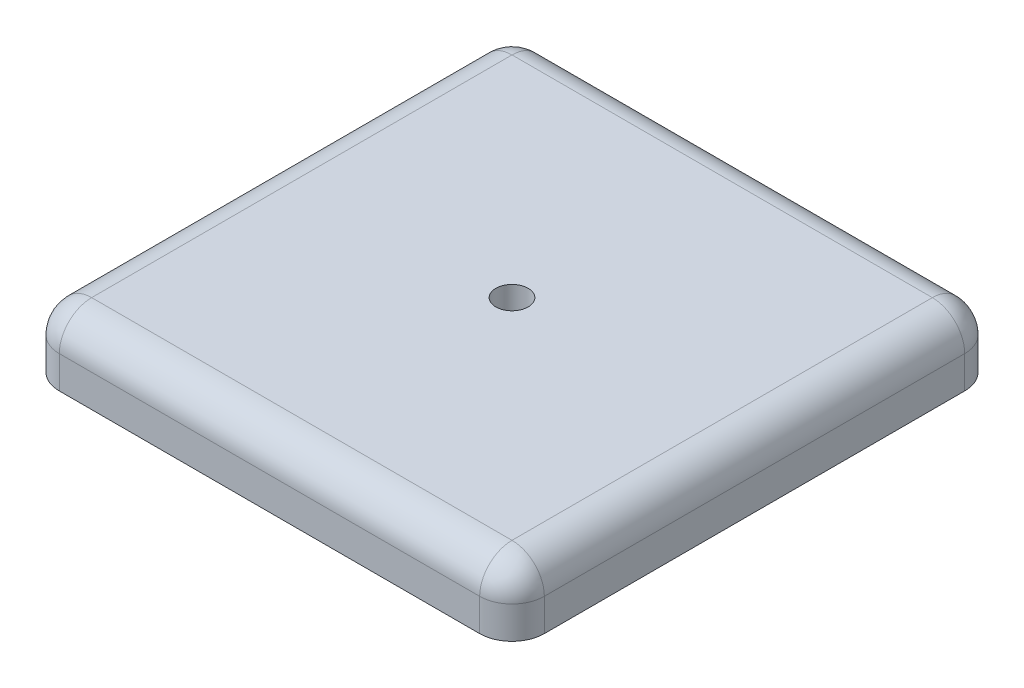
ISO-10303-21;
HEADER;
FILE_DESCRIPTION(('STEP AP214'),'2;1');
FILE_NAME('part.step','',(''),(''),'','','');
FILE_SCHEMA(('AUTOMOTIVE_DESIGN { 1 0 10303 214 1 1 1 1 }'));
ENDSEC;
DATA;
#1=APPLICATION_CONTEXT('core data for automotive mechanical design processes');
#2=APPLICATION_PROTOCOL_DEFINITION('international standard','automotive_design',2000,#1);
#3=PRODUCT_CONTEXT('',#1,'mechanical');
#4=PRODUCT('Part','Part','',(#3));
#5=PRODUCT_RELATED_PRODUCT_CATEGORY('part','',(#4));
#6=PRODUCT_DEFINITION_FORMATION('','',#4);
#7=PRODUCT_DEFINITION_CONTEXT('part definition',#1,'design');
#8=PRODUCT_DEFINITION('design','',#6,#7);
#9=PRODUCT_DEFINITION_SHAPE('','',#8);
#10=(LENGTH_UNIT() NAMED_UNIT(*) SI_UNIT(.MILLI.,.METRE.));
#11=(NAMED_UNIT(*) PLANE_ANGLE_UNIT() SI_UNIT($,.RADIAN.));
#12=(NAMED_UNIT(*) SI_UNIT($,.STERADIAN.) SOLID_ANGLE_UNIT());
#13=UNCERTAINTY_MEASURE_WITH_UNIT(LENGTH_MEASURE(1.E-05),#10,'distance_accuracy_value','');
#14=(GEOMETRIC_REPRESENTATION_CONTEXT(3) GLOBAL_UNCERTAINTY_ASSIGNED_CONTEXT((#13)) GLOBAL_UNIT_ASSIGNED_CONTEXT((#10,
#11,#12)) REPRESENTATION_CONTEXT('',''));
#15=CARTESIAN_POINT('',(0.,0.,0.));
#16=DIRECTION('',(0.,0.,1.));
#17=DIRECTION('',(1.,0.,0.));
#18=AXIS2_PLACEMENT_3D('',#15,#16,#17);
#19=CARTESIAN_POINT('',(0.,0.,0.));
#20=DIRECTION('',(0.,-1.,0.));
#21=DIRECTION('',(0.,0.,-1.));
#22=AXIS2_PLACEMENT_3D('',#19,#20,#21);
#23=PLANE('',#22);
#24=DIRECTION('',(0.,0.,-1.));
#25=VECTOR('',#24,1.);
#26=CARTESIAN_POINT('',(300.,0.,0.));
#27=LINE('',#26,#25);
#28=CARTESIAN_POINT('',(300.,0.,-20.));
#29=VERTEX_POINT('',#28);
#30=CARTESIAN_POINT('',(300.,0.,-280.));
#31=VERTEX_POINT('',#30);
#32=EDGE_CURVE('E291',#29,#31,#27,.T.);
#33=ORIENTED_EDGE('',*,*,#32,.F.);
#34=CARTESIAN_POINT('',(280.,0.,-20.));
#35=DIRECTION('',(0.,-1.,0.));
#36=DIRECTION('',(0.,0.,-1.));
#37=AXIS2_PLACEMENT_3D('',#34,#35,#36);
#38=CIRCLE('',#37,20.);
#39=CARTESIAN_POINT('',(280.,0.,0.));
#40=VERTEX_POINT('',#39);
#41=EDGE_CURVE('E11',#29,#40,#38,.T.);
#42=ORIENTED_EDGE('',*,*,#41,.T.);
#43=DIRECTION('',(1.,0.,0.));
#44=VECTOR('',#43,1.);
#45=CARTESIAN_POINT('',(0.,0.,0.));
#46=LINE('',#45,#44);
#47=CARTESIAN_POINT('',(20.,0.,0.));
#48=VERTEX_POINT('',#47);
#49=EDGE_CURVE('E288',#48,#40,#46,.T.);
#50=ORIENTED_EDGE('',*,*,#49,.F.);
#51=CARTESIAN_POINT('',(20.,0.,-20.));
#52=DIRECTION('',(0.,-1.,0.));
#53=DIRECTION('',(0.,0.,-1.));
#54=AXIS2_PLACEMENT_3D('',#51,#52,#53);
#55=CIRCLE('',#54,20.);
#56=CARTESIAN_POINT('',(0.,0.,-20.));
#57=VERTEX_POINT('',#56);
#58=EDGE_CURVE('E42',#48,#57,#55,.T.);
#59=ORIENTED_EDGE('',*,*,#58,.T.);
#60=DIRECTION('',(0.,0.,1.));
#61=VECTOR('',#60,1.);
#62=CARTESIAN_POINT('',(0.,0.,0.));
#63=LINE('',#62,#61);
#64=CARTESIAN_POINT('',(0.,0.,-280.));
#65=VERTEX_POINT('',#64);
#66=EDGE_CURVE('E285',#65,#57,#63,.T.);
#67=ORIENTED_EDGE('',*,*,#66,.F.);
#68=CARTESIAN_POINT('',(20.,0.,-280.));
#69=DIRECTION('',(0.,-1.,0.));
#70=DIRECTION('',(0.,0.,-1.));
#71=AXIS2_PLACEMENT_3D('',#68,#69,#70);
#72=CIRCLE('',#71,20.);
#73=CARTESIAN_POINT('',(20.,0.,-300.));
#74=VERTEX_POINT('',#73);
#75=EDGE_CURVE('E331',#65,#74,#72,.T.);
#76=ORIENTED_EDGE('',*,*,#75,.T.);
#77=DIRECTION('',(-1.,0.,0.));
#78=VECTOR('',#77,1.);
#79=CARTESIAN_POINT('',(0.,0.,-300.));
#80=LINE('',#79,#78);
#81=CARTESIAN_POINT('',(280.,0.,-300.));
#82=VERTEX_POINT('',#81);
#83=EDGE_CURVE('E294',#82,#74,#80,.T.);
#84=ORIENTED_EDGE('',*,*,#83,.F.);
#85=CARTESIAN_POINT('',(280.,0.,-280.));
#86=DIRECTION('',(0.,-1.,0.));
#87=DIRECTION('',(0.,0.,-1.));
#88=AXIS2_PLACEMENT_3D('',#85,#86,#87);
#89=CIRCLE('',#88,20.);
#90=EDGE_CURVE('E333',#82,#31,#89,.T.);
#91=ORIENTED_EDGE('',*,*,#90,.T.);
#92=EDGE_LOOP('',(#33,#42,#50,#59,#67,#76,#84,#91));
#93=FACE_BOUND('',#92,.T.);
#94=DIRECTION('',(-1.,0.,0.));
#95=VECTOR('',#94,1.);
#96=CARTESIAN_POINT('',(274.5,0.,-25.5));
#97=LINE('',#96,#95);
#98=CARTESIAN_POINT('',(274.5,0.,-25.5));
#99=VERTEX_POINT('',#98);
#100=CARTESIAN_POINT('',(25.5,0.,-25.5));
#101=VERTEX_POINT('',#100);
#102=EDGE_CURVE('E269',#99,#101,#97,.T.);
#103=ORIENTED_EDGE('',*,*,#102,.F.);
#104=DIRECTION('',(0.,0.,1.));
#105=VECTOR('',#104,1.);
#106=CARTESIAN_POINT('',(274.5,0.,-25.5));
#107=LINE('',#106,#105);
#108=CARTESIAN_POINT('',(274.5,0.,-274.5));
#109=VERTEX_POINT('',#108);
#110=EDGE_CURVE('E250',#109,#99,#107,.T.);
#111=ORIENTED_EDGE('',*,*,#110,.F.);
#112=DIRECTION('',(1.,0.,0.));
#113=VECTOR('',#112,1.);
#114=CARTESIAN_POINT('',(274.5,0.,-274.5));
#115=LINE('',#114,#113);
#116=CARTESIAN_POINT('',(25.5,0.,-274.5));
#117=VERTEX_POINT('',#116);
#118=EDGE_CURVE('E260',#117,#109,#115,.T.);
#119=ORIENTED_EDGE('',*,*,#118,.F.);
#120=DIRECTION('',(0.,0.,-1.));
#121=VECTOR('',#120,1.);
#122=CARTESIAN_POINT('',(25.5,0.,-25.5));
#123=LINE('',#122,#121);
#124=EDGE_CURVE('E271',#101,#117,#123,.T.);
#125=ORIENTED_EDGE('',*,*,#124,.F.);
#126=EDGE_LOOP('',(#103,#111,#119,#125));
#127=FACE_BOUND('',#126,.T.);
#128=ADVANCED_FACE('F33',(#93,#127),#23,.T.);
#129=CARTESIAN_POINT('',(0.,40.,0.));
#130=DIRECTION('',(1.,0.,0.));
#131=DIRECTION('',(0.,0.,-1.));
#132=AXIS2_PLACEMENT_3D('',#129,#130,#131);
#133=PLANE('',#132);
#134=ORIENTED_EDGE('',*,*,#66,.T.);
#135=DIRECTION('',(0.,-1.,0.));
#136=VECTOR('',#135,1.);
#137=CARTESIAN_POINT('',(0.,40.,-20.));
#138=LINE('',#137,#136);
#139=CARTESIAN_POINT('',(0.,20.,-20.));
#140=VERTEX_POINT('',#139);
#141=EDGE_CURVE('E329',#57,#140,#138,.F.);
#142=ORIENTED_EDGE('',*,*,#141,.T.);
#143=DIRECTION('',(0.,0.,1.));
#144=VECTOR('',#143,1.);
#145=CARTESIAN_POINT('',(0.,20.,0.));
#146=LINE('',#145,#144);
#147=CARTESIAN_POINT('',(0.,20.,-280.));
#148=VERTEX_POINT('',#147);
#149=EDGE_CURVE('E327',#140,#148,#146,.F.);
#150=ORIENTED_EDGE('',*,*,#149,.T.);
#151=DIRECTION('',(0.,-1.,0.));
#152=VECTOR('',#151,1.);
#153=CARTESIAN_POINT('',(0.,40.,-280.));
#154=LINE('',#153,#152);
#155=EDGE_CURVE('E325',#148,#65,#154,.T.);
#156=ORIENTED_EDGE('',*,*,#155,.T.);
#157=EDGE_LOOP('',(#134,#142,#150,#156));
#158=FACE_BOUND('',#157,.T.);
#159=ADVANCED_FACE('F405',(#158),#133,.F.);
#160=CARTESIAN_POINT('',(0.,40.,0.));
#161=DIRECTION('',(0.,0.,-1.));
#162=DIRECTION('',(-1.,0.,0.));
#163=AXIS2_PLACEMENT_3D('',#160,#161,#162);
#164=PLANE('',#163);
#165=ORIENTED_EDGE('',*,*,#49,.T.);
#166=DIRECTION('',(0.,-1.,0.));
#167=VECTOR('',#166,1.);
#168=CARTESIAN_POINT('',(280.,40.,0.));
#169=LINE('',#168,#167);
#170=CARTESIAN_POINT('',(280.,20.,0.));
#171=VERTEX_POINT('',#170);
#172=EDGE_CURVE('E323',#40,#171,#169,.F.);
#173=ORIENTED_EDGE('',*,*,#172,.T.);
#174=DIRECTION('',(1.,0.,0.));
#175=VECTOR('',#174,1.);
#176=CARTESIAN_POINT('',(0.,20.,0.));
#177=LINE('',#176,#175);
#178=CARTESIAN_POINT('',(20.,20.,0.));
#179=VERTEX_POINT('',#178);
#180=EDGE_CURVE('E321',#171,#179,#177,.F.);
#181=ORIENTED_EDGE('',*,*,#180,.T.);
#182=DIRECTION('',(0.,-1.,0.));
#183=VECTOR('',#182,1.);
#184=CARTESIAN_POINT('',(20.,40.,0.));
#185=LINE('',#184,#183);
#186=EDGE_CURVE('E319',#179,#48,#185,.T.);
#187=ORIENTED_EDGE('',*,*,#186,.T.);
#188=EDGE_LOOP('',(#165,#173,#181,#187));
#189=FACE_BOUND('',#188,.T.);
#190=ADVANCED_FACE('F391',(#189),#164,.F.);
#191=CARTESIAN_POINT('',(300.,40.,0.));
#192=DIRECTION('',(-1.,0.,0.));
#193=DIRECTION('',(0.,0.,1.));
#194=AXIS2_PLACEMENT_3D('',#191,#192,#193);
#195=PLANE('',#194);
#196=DIRECTION('',(0.,0.,-1.));
#197=VECTOR('',#196,1.);
#198=CARTESIAN_POINT('',(300.,20.,0.));
#199=LINE('',#198,#197);
#200=CARTESIAN_POINT('',(300.,20.,-280.));
#201=VERTEX_POINT('',#200);
#202=CARTESIAN_POINT('',(300.,20.,-20.));
#203=VERTEX_POINT('',#202);
#204=EDGE_CURVE('E315',#201,#203,#199,.F.);
#205=ORIENTED_EDGE('',*,*,#204,.T.);
#206=DIRECTION('',(0.,-1.,0.));
#207=VECTOR('',#206,1.);
#208=CARTESIAN_POINT('',(300.,40.,-20.));
#209=LINE('',#208,#207);
#210=EDGE_CURVE('E317',#203,#29,#209,.T.);
#211=ORIENTED_EDGE('',*,*,#210,.T.);
#212=ORIENTED_EDGE('',*,*,#32,.T.);
#213=DIRECTION('',(0.,-1.,0.));
#214=VECTOR('',#213,1.);
#215=CARTESIAN_POINT('',(300.,40.,-280.));
#216=LINE('',#215,#214);
#217=EDGE_CURVE('E313',#31,#201,#216,.F.);
#218=ORIENTED_EDGE('',*,*,#217,.T.);
#219=EDGE_LOOP('',(#205,#211,#212,#218));
#220=FACE_BOUND('',#219,.T.);
#221=ADVANCED_FACE('F430',(#220),#195,.F.);
#222=CARTESIAN_POINT('',(0.,40.,-300.));
#223=DIRECTION('',(0.,0.,1.));
#224=DIRECTION('',(1.,0.,0.));
#225=AXIS2_PLACEMENT_3D('',#222,#223,#224);
#226=PLANE('',#225);
#227=DIRECTION('',(-1.,0.,0.));
#228=VECTOR('',#227,1.);
#229=CARTESIAN_POINT('',(0.,20.,-300.));
#230=LINE('',#229,#228);
#231=CARTESIAN_POINT('',(20.,20.,-300.));
#232=VERTEX_POINT('',#231);
#233=CARTESIAN_POINT('',(280.,20.,-300.));
#234=VERTEX_POINT('',#233);
#235=EDGE_CURVE('E308',#232,#234,#230,.F.);
#236=ORIENTED_EDGE('',*,*,#235,.T.);
#237=DIRECTION('',(0.,-1.,0.));
#238=VECTOR('',#237,1.);
#239=CARTESIAN_POINT('',(280.,40.,-300.));
#240=LINE('',#239,#238);
#241=EDGE_CURVE('E311',#234,#82,#240,.T.);
#242=ORIENTED_EDGE('',*,*,#241,.T.);
#243=ORIENTED_EDGE('',*,*,#83,.T.);
#244=DIRECTION('',(0.,-1.,0.));
#245=VECTOR('',#244,1.);
#246=CARTESIAN_POINT('',(20.,40.,-300.));
#247=LINE('',#246,#245);
#248=EDGE_CURVE('E306',#74,#232,#247,.F.);
#249=ORIENTED_EDGE('',*,*,#248,.T.);
#250=EDGE_LOOP('',(#236,#242,#243,#249));
#251=FACE_BOUND('',#250,.T.);
#252=ADVANCED_FACE('F422',(#251),#226,.F.);
#253=CARTESIAN_POINT('',(0.,40.,0.));
#254=DIRECTION('',(0.,-1.,0.));
#255=DIRECTION('',(0.,0.,-1.));
#256=AXIS2_PLACEMENT_3D('',#253,#254,#255);
#257=PLANE('',#256);
#258=CARTESIAN_POINT('',(150.,40.,-150.));
#259=DIRECTION('',(0.,-1.,0.));
#260=DIRECTION('',(0.,0.,-1.));
#261=AXIS2_PLACEMENT_3D('',#258,#259,#260);
#262=CIRCLE('',#261,10.);
#263=CARTESIAN_POINT('',(150.,40.,-160.));
#264=VERTEX_POINT('',#263);
#265=EDGE_CURVE('E216',#264,#264,#262,.T.);
#266=ORIENTED_EDGE('',*,*,#265,.T.);
#267=EDGE_LOOP('',(#266));
#268=FACE_BOUND('',#267,.T.);
#269=DIRECTION('',(0.,0.,-1.));
#270=VECTOR('',#269,1.);
#271=CARTESIAN_POINT('',(280.,40.,0.));
#272=LINE('',#271,#270);
#273=CARTESIAN_POINT('',(280.,40.,-20.));
#274=VERTEX_POINT('',#273);
#275=CARTESIAN_POINT('',(280.,40.,-280.));
#276=VERTEX_POINT('',#275);
#277=EDGE_CURVE('E301',#274,#276,#272,.T.);
#278=ORIENTED_EDGE('',*,*,#277,.T.);
#279=DIRECTION('',(-1.,0.,0.));
#280=VECTOR('',#279,1.);
#281=CARTESIAN_POINT('',(0.,40.,-280.));
#282=LINE('',#281,#280);
#283=CARTESIAN_POINT('',(20.,40.,-280.));
#284=VERTEX_POINT('',#283);
#285=EDGE_CURVE('E303',#276,#284,#282,.T.);
#286=ORIENTED_EDGE('',*,*,#285,.T.);
#287=DIRECTION('',(0.,0.,1.));
#288=VECTOR('',#287,1.);
#289=CARTESIAN_POINT('',(20.,40.,0.));
#290=LINE('',#289,#288);
#291=CARTESIAN_POINT('',(20.,40.,-20.));
#292=VERTEX_POINT('',#291);
#293=EDGE_CURVE('E297',#284,#292,#290,.T.);
#294=ORIENTED_EDGE('',*,*,#293,.T.);
#295=DIRECTION('',(1.,0.,0.));
#296=VECTOR('',#295,1.);
#297=CARTESIAN_POINT('',(0.,40.,-20.));
#298=LINE('',#297,#296);
#299=EDGE_CURVE('E299',#292,#274,#298,.T.);
#300=ORIENTED_EDGE('',*,*,#299,.T.);
#301=EDGE_LOOP('',(#278,#286,#294,#300));
#302=FACE_BOUND('',#301,.T.);
#303=ADVANCED_FACE('F381',(#268,#302),#257,.F.);
#304=CARTESIAN_POINT('',(280.,40.,-20.));
#305=DIRECTION('',(0.,-1.,0.));
#306=DIRECTION('',(0.,0.,-1.));
#307=AXIS2_PLACEMENT_3D('',#304,#305,#306);
#308=CYLINDRICAL_SURFACE('',#307,20.);
#309=ORIENTED_EDGE('',*,*,#41,.F.);
#310=ORIENTED_EDGE('',*,*,#210,.F.);
#311=CARTESIAN_POINT('',(280.,20.,-20.));
#312=DIRECTION('',(0.,1.,0.));
#313=DIRECTION('',(0.,0.,1.));
#314=AXIS2_PLACEMENT_3D('',#311,#312,#313);
#315=CIRCLE('',#314,20.);
#316=EDGE_CURVE('E37',#171,#203,#315,.T.);
#317=ORIENTED_EDGE('',*,*,#316,.F.);
#318=ORIENTED_EDGE('',*,*,#172,.F.);
#319=EDGE_LOOP('',(#309,#310,#317,#318));
#320=FACE_BOUND('',#319,.T.);
#321=ADVANCED_FACE('F35',(#320),#308,.T.);
#322=CARTESIAN_POINT('',(0.,20.,-20.));
#323=DIRECTION('',(1.,0.,0.));
#324=DIRECTION('',(0.,0.,-1.));
#325=AXIS2_PLACEMENT_3D('',#322,#323,#324);
#326=CYLINDRICAL_SURFACE('',#325,20.);
#327=CARTESIAN_POINT('',(20.,20.,-20.));
#328=DIRECTION('',(-1.,0.,0.));
#329=DIRECTION('',(0.,0.,1.));
#330=AXIS2_PLACEMENT_3D('',#327,#328,#329);
#331=CIRCLE('',#330,20.);
#332=EDGE_CURVE('E360',#179,#292,#331,.T.);
#333=ORIENTED_EDGE('',*,*,#332,.F.);
#334=ORIENTED_EDGE('',*,*,#180,.F.);
#335=CARTESIAN_POINT('',(280.,20.,-20.));
#336=DIRECTION('',(1.,0.,0.));
#337=DIRECTION('',(0.,0.,-1.));
#338=AXIS2_PLACEMENT_3D('',#335,#336,#337);
#339=CIRCLE('',#338,20.);
#340=EDGE_CURVE('E362',#274,#171,#339,.T.);
#341=ORIENTED_EDGE('',*,*,#340,.F.);
#342=ORIENTED_EDGE('',*,*,#299,.F.);
#343=EDGE_LOOP('',(#333,#334,#341,#342));
#344=FACE_BOUND('',#343,.T.);
#345=ADVANCED_FACE('F388',(#344),#326,.T.);
#346=CARTESIAN_POINT('',(20.,40.,-20.));
#347=DIRECTION('',(0.,-1.,0.));
#348=DIRECTION('',(0.,0.,-1.));
#349=AXIS2_PLACEMENT_3D('',#346,#347,#348);
#350=CYLINDRICAL_SURFACE('',#349,20.);
#351=ORIENTED_EDGE('',*,*,#58,.F.);
#352=ORIENTED_EDGE('',*,*,#186,.F.);
#353=CARTESIAN_POINT('',(20.,20.,-20.));
#354=DIRECTION('',(0.,1.,0.));
#355=DIRECTION('',(0.,0.,1.));
#356=AXIS2_PLACEMENT_3D('',#353,#354,#355);
#357=CIRCLE('',#356,20.);
#358=EDGE_CURVE('E357',#140,#179,#357,.T.);
#359=ORIENTED_EDGE('',*,*,#358,.F.);
#360=ORIENTED_EDGE('',*,*,#141,.F.);
#361=EDGE_LOOP('',(#351,#352,#359,#360));
#362=FACE_BOUND('',#361,.T.);
#363=ADVANCED_FACE('F396',(#362),#350,.T.);
#364=CARTESIAN_POINT('',(280.,20.,-20.));
#365=DIRECTION('',(0.,0.,1.));
#366=DIRECTION('',(1.,0.,0.));
#367=AXIS2_PLACEMENT_3D('',#364,#365,#366);
#368=SPHERICAL_SURFACE('',#367,20.);
#369=ORIENTED_EDGE('',*,*,#340,.T.);
#370=ORIENTED_EDGE('',*,*,#316,.T.);
#371=CARTESIAN_POINT('',(280.,20.,-20.));
#372=DIRECTION('',(0.,0.,1.));
#373=DIRECTION('',(1.,0.,0.));
#374=AXIS2_PLACEMENT_3D('',#371,#372,#373);
#375=CIRCLE('',#374,20.);
#376=EDGE_CURVE('E354',#274,#203,#375,.F.);
#377=ORIENTED_EDGE('',*,*,#376,.F.);
#378=EDGE_LOOP('',(#369,#370,#377));
#379=FACE_BOUND('',#378,.T.);
#380=ADVANCED_FACE('F369',(#379),#368,.T.);
#381=CARTESIAN_POINT('',(20.,20.,-20.));
#382=DIRECTION('',(0.,0.,1.));
#383=DIRECTION('',(1.,0.,0.));
#384=AXIS2_PLACEMENT_3D('',#381,#382,#383);
#385=SPHERICAL_SURFACE('',#384,20.);
#386=ORIENTED_EDGE('',*,*,#358,.T.);
#387=ORIENTED_EDGE('',*,*,#332,.T.);
#388=CARTESIAN_POINT('',(20.,20.,-20.));
#389=DIRECTION('',(0.,0.,1.));
#390=DIRECTION('',(1.,0.,0.));
#391=AXIS2_PLACEMENT_3D('',#388,#389,#390);
#392=CIRCLE('',#391,20.);
#393=EDGE_CURVE('E351',#140,#292,#392,.F.);
#394=ORIENTED_EDGE('',*,*,#393,.F.);
#395=EDGE_LOOP('',(#386,#387,#394));
#396=FACE_BOUND('',#395,.T.);
#397=ADVANCED_FACE('F471',(#396),#385,.T.);
#398=CARTESIAN_POINT('',(280.,40.,-280.));
#399=DIRECTION('',(0.,-1.,0.));
#400=DIRECTION('',(0.,0.,-1.));
#401=AXIS2_PLACEMENT_3D('',#398,#399,#400);
#402=CYLINDRICAL_SURFACE('',#401,20.);
#403=ORIENTED_EDGE('',*,*,#90,.F.);
#404=ORIENTED_EDGE('',*,*,#241,.F.);
#405=CARTESIAN_POINT('',(280.,20.,-280.));
#406=DIRECTION('',(0.,1.,0.));
#407=DIRECTION('',(0.,0.,1.));
#408=AXIS2_PLACEMENT_3D('',#405,#406,#407);
#409=CIRCLE('',#408,20.);
#410=EDGE_CURVE('E348',#201,#234,#409,.T.);
#411=ORIENTED_EDGE('',*,*,#410,.F.);
#412=ORIENTED_EDGE('',*,*,#217,.F.);
#413=EDGE_LOOP('',(#403,#404,#411,#412));
#414=FACE_BOUND('',#413,.T.);
#415=ADVANCED_FACE('F428',(#414),#402,.T.);
#416=CARTESIAN_POINT('',(280.,20.,0.));
#417=DIRECTION('',(0.,0.,-1.));
#418=DIRECTION('',(-1.,0.,0.));
#419=AXIS2_PLACEMENT_3D('',#416,#417,#418);
#420=CYLINDRICAL_SURFACE('',#419,20.);
#421=ORIENTED_EDGE('',*,*,#376,.T.);
#422=ORIENTED_EDGE('',*,*,#204,.F.);
#423=CARTESIAN_POINT('',(280.,20.,-280.));
#424=DIRECTION('',(0.,0.,-1.));
#425=DIRECTION('',(-1.,0.,0.));
#426=AXIS2_PLACEMENT_3D('',#423,#424,#425);
#427=CIRCLE('',#426,20.);
#428=EDGE_CURVE('E345',#276,#201,#427,.T.);
#429=ORIENTED_EDGE('',*,*,#428,.F.);
#430=ORIENTED_EDGE('',*,*,#277,.F.);
#431=EDGE_LOOP('',(#421,#422,#429,#430));
#432=FACE_BOUND('',#431,.T.);
#433=ADVANCED_FACE('F376',(#432),#420,.T.);
#434=CARTESIAN_POINT('',(20.,20.,0.));
#435=DIRECTION('',(0.,0.,1.));
#436=DIRECTION('',(1.,0.,0.));
#437=AXIS2_PLACEMENT_3D('',#434,#435,#436);
#438=CYLINDRICAL_SURFACE('',#437,20.);
#439=ORIENTED_EDGE('',*,*,#393,.T.);
#440=ORIENTED_EDGE('',*,*,#293,.F.);
#441=CARTESIAN_POINT('',(20.,20.,-280.));
#442=DIRECTION('',(0.,0.,-1.));
#443=DIRECTION('',(-1.,0.,0.));
#444=AXIS2_PLACEMENT_3D('',#441,#442,#443);
#445=CIRCLE('',#444,20.);
#446=EDGE_CURVE('E342',#148,#284,#445,.T.);
#447=ORIENTED_EDGE('',*,*,#446,.F.);
#448=ORIENTED_EDGE('',*,*,#149,.F.);
#449=EDGE_LOOP('',(#439,#440,#447,#448));
#450=FACE_BOUND('',#449,.T.);
#451=ADVANCED_FACE('F415',(#450),#438,.T.);
#452=CARTESIAN_POINT('',(20.,40.,-280.));
#453=DIRECTION('',(0.,-1.,0.));
#454=DIRECTION('',(0.,0.,-1.));
#455=AXIS2_PLACEMENT_3D('',#452,#453,#454);
#456=CYLINDRICAL_SURFACE('',#455,20.);
#457=ORIENTED_EDGE('',*,*,#75,.F.);
#458=ORIENTED_EDGE('',*,*,#155,.F.);
#459=CARTESIAN_POINT('',(20.,20.,-280.));
#460=DIRECTION('',(0.,1.,0.));
#461=DIRECTION('',(0.,0.,1.));
#462=AXIS2_PLACEMENT_3D('',#459,#460,#461);
#463=CIRCLE('',#462,20.);
#464=EDGE_CURVE('E339',#232,#148,#463,.T.);
#465=ORIENTED_EDGE('',*,*,#464,.F.);
#466=ORIENTED_EDGE('',*,*,#248,.F.);
#467=EDGE_LOOP('',(#457,#458,#465,#466));
#468=FACE_BOUND('',#467,.T.);
#469=ADVANCED_FACE('F411',(#468),#456,.T.);
#470=CARTESIAN_POINT('',(280.,20.,-280.));
#471=DIRECTION('',(0.,0.,1.));
#472=DIRECTION('',(1.,0.,0.));
#473=AXIS2_PLACEMENT_3D('',#470,#471,#472);
#474=SPHERICAL_SURFACE('',#473,20.);
#475=ORIENTED_EDGE('',*,*,#428,.T.);
#476=ORIENTED_EDGE('',*,*,#410,.T.);
#477=CARTESIAN_POINT('',(280.,20.,-280.));
#478=DIRECTION('',(1.,0.,0.));
#479=DIRECTION('',(0.,0.,-1.));
#480=AXIS2_PLACEMENT_3D('',#477,#478,#479);
#481=CIRCLE('',#480,20.);
#482=EDGE_CURVE('E337',#276,#234,#481,.F.);
#483=ORIENTED_EDGE('',*,*,#482,.F.);
#484=EDGE_LOOP('',(#475,#476,#483));
#485=FACE_BOUND('',#484,.T.);
#486=ADVANCED_FACE('F459',(#485),#474,.T.);
#487=CARTESIAN_POINT('',(20.,20.,-280.));
#488=DIRECTION('',(0.,0.,1.));
#489=DIRECTION('',(1.,0.,0.));
#490=AXIS2_PLACEMENT_3D('',#487,#488,#489);
#491=SPHERICAL_SURFACE('',#490,20.);
#492=ORIENTED_EDGE('',*,*,#464,.T.);
#493=ORIENTED_EDGE('',*,*,#446,.T.);
#494=CARTESIAN_POINT('',(20.,20.,-280.));
#495=DIRECTION('',(-1.,0.,0.));
#496=DIRECTION('',(0.,0.,1.));
#497=AXIS2_PLACEMENT_3D('',#494,#495,#496);
#498=CIRCLE('',#497,20.);
#499=EDGE_CURVE('E284',#232,#284,#498,.F.);
#500=ORIENTED_EDGE('',*,*,#499,.F.);
#501=EDGE_LOOP('',(#492,#493,#500));
#502=FACE_BOUND('',#501,.T.);
#503=ADVANCED_FACE('F418',(#502),#491,.T.);
#504=CARTESIAN_POINT('',(0.,20.,-280.));
#505=DIRECTION('',(-1.,0.,0.));
#506=DIRECTION('',(0.,0.,1.));
#507=AXIS2_PLACEMENT_3D('',#504,#505,#506);
#508=CYLINDRICAL_SURFACE('',#507,20.);
#509=ORIENTED_EDGE('',*,*,#482,.T.);
#510=ORIENTED_EDGE('',*,*,#235,.F.);
#511=ORIENTED_EDGE('',*,*,#499,.T.);
#512=ORIENTED_EDGE('',*,*,#285,.F.);
#513=EDGE_LOOP('',(#509,#510,#511,#512));
#514=FACE_BOUND('',#513,.T.);
#515=ADVANCED_FACE('F420',(#514),#508,.T.);
#516=CARTESIAN_POINT('',(274.5,-15.,-25.5));
#517=DIRECTION('',(-1.,0.,0.));
#518=DIRECTION('',(0.,0.,1.));
#519=AXIS2_PLACEMENT_3D('',#516,#517,#518);
#520=PLANE('',#519);
#521=ORIENTED_EDGE('',*,*,#110,.T.);
#522=DIRECTION('',(0.,1.,0.));
#523=VECTOR('',#522,1.);
#524=CARTESIAN_POINT('',(274.5,-15.,-25.5));
#525=LINE('',#524,#523);
#526=CARTESIAN_POINT('',(274.5,-15.,-25.5));
#527=VERTEX_POINT('',#526);
#528=EDGE_CURVE('E282',#527,#99,#525,.T.);
#529=ORIENTED_EDGE('',*,*,#528,.F.);
#530=DIRECTION('',(0.,0.,1.));
#531=VECTOR('',#530,1.);
#532=CARTESIAN_POINT('',(274.5,-15.,-25.5));
#533=LINE('',#532,#531);
#534=CARTESIAN_POINT('',(274.5,-15.,-274.5));
#535=VERTEX_POINT('',#534);
#536=EDGE_CURVE('E256',#535,#527,#533,.T.);
#537=ORIENTED_EDGE('',*,*,#536,.F.);
#538=DIRECTION('',(0.,1.,0.));
#539=VECTOR('',#538,1.);
#540=CARTESIAN_POINT('',(274.5,-15.,-274.5));
#541=LINE('',#540,#539);
#542=EDGE_CURVE('E266',#535,#109,#541,.T.);
#543=ORIENTED_EDGE('',*,*,#542,.T.);
#544=EDGE_LOOP('',(#521,#529,#537,#543));
#545=FACE_BOUND('',#544,.T.);
#546=ADVANCED_FACE('F456',(#545),#520,.F.);
#547=CARTESIAN_POINT('',(274.5,-15.,-25.5));
#548=DIRECTION('',(0.,0.,-1.));
#549=DIRECTION('',(-1.,0.,0.));
#550=AXIS2_PLACEMENT_3D('',#547,#548,#549);
#551=PLANE('',#550);
#552=ORIENTED_EDGE('',*,*,#102,.T.);
#553=DIRECTION('',(0.,1.,0.));
#554=VECTOR('',#553,1.);
#555=CARTESIAN_POINT('',(25.5,-15.,-25.5));
#556=LINE('',#555,#554);
#557=CARTESIAN_POINT('',(25.5,-15.,-25.5));
#558=VERTEX_POINT('',#557);
#559=EDGE_CURVE('E279',#558,#101,#556,.T.);
#560=ORIENTED_EDGE('',*,*,#559,.F.);
#561=DIRECTION('',(-1.,0.,0.));
#562=VECTOR('',#561,1.);
#563=CARTESIAN_POINT('',(274.5,-15.,-25.5));
#564=LINE('',#563,#562);
#565=EDGE_CURVE('E259',#527,#558,#564,.T.);
#566=ORIENTED_EDGE('',*,*,#565,.F.);
#567=ORIENTED_EDGE('',*,*,#528,.T.);
#568=EDGE_LOOP('',(#552,#560,#566,#567));
#569=FACE_BOUND('',#568,.T.);
#570=ADVANCED_FACE('F524',(#569),#551,.F.);
#571=CARTESIAN_POINT('',(25.5,-15.,-25.5));
#572=DIRECTION('',(1.,0.,0.));
#573=DIRECTION('',(0.,0.,-1.));
#574=AXIS2_PLACEMENT_3D('',#571,#572,#573);
#575=PLANE('',#574);
#576=ORIENTED_EDGE('',*,*,#124,.T.);
#577=DIRECTION('',(0.,1.,0.));
#578=VECTOR('',#577,1.);
#579=CARTESIAN_POINT('',(25.5,-15.,-274.5));
#580=LINE('',#579,#578);
#581=CARTESIAN_POINT('',(25.5,-15.,-274.5));
#582=VERTEX_POINT('',#581);
#583=EDGE_CURVE('E277',#582,#117,#580,.T.);
#584=ORIENTED_EDGE('',*,*,#583,.F.);
#585=DIRECTION('',(0.,0.,-1.));
#586=VECTOR('',#585,1.);
#587=CARTESIAN_POINT('',(25.5,-15.,-25.5));
#588=LINE('',#587,#586);
#589=EDGE_CURVE('E262',#558,#582,#588,.T.);
#590=ORIENTED_EDGE('',*,*,#589,.F.);
#591=ORIENTED_EDGE('',*,*,#559,.T.);
#592=EDGE_LOOP('',(#576,#584,#590,#591));
#593=FACE_BOUND('',#592,.T.);
#594=ADVANCED_FACE('F531',(#593),#575,.F.);
#595=CARTESIAN_POINT('',(274.5,-15.,-274.5));
#596=DIRECTION('',(0.,0.,1.));
#597=DIRECTION('',(1.,0.,0.));
#598=AXIS2_PLACEMENT_3D('',#595,#596,#597);
#599=PLANE('',#598);
#600=ORIENTED_EDGE('',*,*,#118,.T.);
#601=ORIENTED_EDGE('',*,*,#542,.F.);
#602=DIRECTION('',(1.,0.,0.));
#603=VECTOR('',#602,1.);
#604=CARTESIAN_POINT('',(274.5,-15.,-274.5));
#605=LINE('',#604,#603);
#606=EDGE_CURVE('E264',#582,#535,#605,.T.);
#607=ORIENTED_EDGE('',*,*,#606,.F.);
#608=ORIENTED_EDGE('',*,*,#583,.T.);
#609=EDGE_LOOP('',(#600,#601,#607,#608));
#610=FACE_BOUND('',#609,.T.);
#611=ADVANCED_FACE('F539',(#610),#599,.F.);
#612=CARTESIAN_POINT('',(0.,-15.,0.));
#613=DIRECTION('',(0.,1.,0.));
#614=DIRECTION('',(0.,0.,1.));
#615=AXIS2_PLACEMENT_3D('',#612,#613,#614);
#616=PLANE('',#615);
#617=CARTESIAN_POINT('',(150.,-15.,-150.));
#618=DIRECTION('',(0.,-1.,0.));
#619=DIRECTION('',(0.,0.,-1.));
#620=AXIS2_PLACEMENT_3D('',#617,#618,#619);
#621=CIRCLE('',#620,10.);
#622=CARTESIAN_POINT('',(150.,-15.,-160.));
#623=VERTEX_POINT('',#622);
#624=EDGE_CURVE('E209',#623,#623,#621,.T.);
#625=ORIENTED_EDGE('',*,*,#624,.F.);
#626=EDGE_LOOP('',(#625));
#627=FACE_BOUND('',#626,.T.);
#628=DIRECTION('',(1.,0.,0.));
#629=VECTOR('',#628,1.);
#630=CARTESIAN_POINT('',(80.,-15.,-240.));
#631=LINE('',#630,#629);
#632=CARTESIAN_POINT('',(80.,-15.,-240.));
#633=VERTEX_POINT('',#632);
#634=CARTESIAN_POINT('',(220.,-15.,-240.));
#635=VERTEX_POINT('',#634);
#636=EDGE_CURVE('E215',#633,#635,#631,.T.);
#637=ORIENTED_EDGE('',*,*,#636,.F.);
#638=DIRECTION('',(0.,0.,-1.));
#639=VECTOR('',#638,1.);
#640=CARTESIAN_POINT('',(80.,-15.,-180.));
#641=LINE('',#640,#639);
#642=CARTESIAN_POINT('',(80.,-15.,-180.));
#643=VERTEX_POINT('',#642);
#644=EDGE_CURVE('E50',#643,#633,#641,.T.);
#645=ORIENTED_EDGE('',*,*,#644,.F.);
#646=DIRECTION('',(-1.,0.,0.));
#647=VECTOR('',#646,1.);
#648=CARTESIAN_POINT('',(80.,-15.,-180.));
#649=LINE('',#648,#647);
#650=CARTESIAN_POINT('',(220.,-15.,-180.));
#651=VERTEX_POINT('',#650);
#652=EDGE_CURVE('E203',#651,#643,#649,.T.);
#653=ORIENTED_EDGE('',*,*,#652,.F.);
#654=DIRECTION('',(0.,0.,1.));
#655=VECTOR('',#654,1.);
#656=CARTESIAN_POINT('',(220.,-15.,-180.));
#657=LINE('',#656,#655);
#658=EDGE_CURVE('E206',#635,#651,#657,.T.);
#659=ORIENTED_EDGE('',*,*,#658,.F.);
#660=EDGE_LOOP('',(#637,#645,#653,#659));
#661=FACE_BOUND('',#660,.T.);
#662=DIRECTION('',(1.,0.,0.));
#663=VECTOR('',#662,1.);
#664=CARTESIAN_POINT('',(80.,-15.,-120.));
#665=LINE('',#664,#663);
#666=CARTESIAN_POINT('',(80.,-15.,-120.));
#667=VERTEX_POINT('',#666);
#668=CARTESIAN_POINT('',(220.,-15.,-120.));
#669=VERTEX_POINT('',#668);
#670=EDGE_CURVE('E240',#667,#669,#665,.T.);
#671=ORIENTED_EDGE('',*,*,#670,.F.);
#672=DIRECTION('',(0.,0.,-1.));
#673=VECTOR('',#672,1.);
#674=CARTESIAN_POINT('',(80.,-15.,-60.));
#675=LINE('',#674,#673);
#676=CARTESIAN_POINT('',(80.,-15.,-60.));
#677=VERTEX_POINT('',#676);
#678=EDGE_CURVE('E58',#677,#667,#675,.T.);
#679=ORIENTED_EDGE('',*,*,#678,.F.);
#680=DIRECTION('',(-1.,0.,0.));
#681=VECTOR('',#680,1.);
#682=CARTESIAN_POINT('',(80.,-15.,-60.));
#683=LINE('',#682,#681);
#684=CARTESIAN_POINT('',(220.,-15.,-60.));
#685=VERTEX_POINT('',#684);
#686=EDGE_CURVE('E229',#685,#677,#683,.T.);
#687=ORIENTED_EDGE('',*,*,#686,.F.);
#688=DIRECTION('',(0.,0.,1.));
#689=VECTOR('',#688,1.);
#690=CARTESIAN_POINT('',(220.,-15.,-60.));
#691=LINE('',#690,#689);
#692=EDGE_CURVE('E243',#669,#685,#691,.T.);
#693=ORIENTED_EDGE('',*,*,#692,.F.);
#694=EDGE_LOOP('',(#671,#679,#687,#693));
#695=FACE_BOUND('',#694,.T.);
#696=ORIENTED_EDGE('',*,*,#536,.T.);
#697=ORIENTED_EDGE('',*,*,#565,.T.);
#698=ORIENTED_EDGE('',*,*,#589,.T.);
#699=ORIENTED_EDGE('',*,*,#606,.T.);
#700=EDGE_LOOP('',(#696,#697,#698,#699));
#701=FACE_BOUND('',#700,.T.);
#702=ADVANCED_FACE('F547',(#627,#661,#695,#701),#616,.F.);
#703=CARTESIAN_POINT('',(80.,10.,-60.));
#704=DIRECTION('',(-1.,0.,0.));
#705=DIRECTION('',(0.,0.,1.));
#706=AXIS2_PLACEMENT_3D('',#703,#704,#705);
#707=PLANE('',#706);
#708=ORIENTED_EDGE('',*,*,#678,.T.);
#709=DIRECTION('',(0.,-1.,0.));
#710=VECTOR('',#709,1.);
#711=CARTESIAN_POINT('',(80.,10.,-120.));
#712=LINE('',#711,#710);
#713=CARTESIAN_POINT('',(80.,10.,-120.));
#714=VERTEX_POINT('',#713);
#715=EDGE_CURVE('E238',#714,#667,#712,.T.);
#716=ORIENTED_EDGE('',*,*,#715,.F.);
#717=DIRECTION('',(0.,0.,-1.));
#718=VECTOR('',#717,1.);
#719=CARTESIAN_POINT('',(80.,10.,-60.));
#720=LINE('',#719,#718);
#721=CARTESIAN_POINT('',(80.,10.,-60.));
#722=VERTEX_POINT('',#721);
#723=EDGE_CURVE('E225',#722,#714,#720,.T.);
#724=ORIENTED_EDGE('',*,*,#723,.F.);
#725=DIRECTION('',(0.,-1.,0.));
#726=VECTOR('',#725,1.);
#727=CARTESIAN_POINT('',(80.,10.,-60.));
#728=LINE('',#727,#726);
#729=EDGE_CURVE('E248',#722,#677,#728,.T.);
#730=ORIENTED_EDGE('',*,*,#729,.T.);
#731=EDGE_LOOP('',(#708,#716,#724,#730));
#732=FACE_BOUND('',#731,.T.);
#733=ADVANCED_FACE('F557',(#732),#707,.F.);
#734=CARTESIAN_POINT('',(80.,10.,-60.));
#735=DIRECTION('',(0.,0.,1.));
#736=DIRECTION('',(1.,0.,0.));
#737=AXIS2_PLACEMENT_3D('',#734,#735,#736);
#738=PLANE('',#737);
#739=ORIENTED_EDGE('',*,*,#686,.T.);
#740=ORIENTED_EDGE('',*,*,#729,.F.);
#741=DIRECTION('',(-1.,0.,0.));
#742=VECTOR('',#741,1.);
#743=CARTESIAN_POINT('',(80.,10.,-60.));
#744=LINE('',#743,#742);
#745=CARTESIAN_POINT('',(220.,10.,-60.));
#746=VERTEX_POINT('',#745);
#747=EDGE_CURVE('E235',#746,#722,#744,.T.);
#748=ORIENTED_EDGE('',*,*,#747,.F.);
#749=DIRECTION('',(0.,-1.,0.));
#750=VECTOR('',#749,1.);
#751=CARTESIAN_POINT('',(220.,10.,-60.));
#752=LINE('',#751,#750);
#753=EDGE_CURVE('E251',#746,#685,#752,.T.);
#754=ORIENTED_EDGE('',*,*,#753,.T.);
#755=EDGE_LOOP('',(#739,#740,#748,#754));
#756=FACE_BOUND('',#755,.T.);
#757=ADVANCED_FACE('F567',(#756),#738,.F.);
#758=CARTESIAN_POINT('',(220.,10.,-60.));
#759=DIRECTION('',(1.,0.,0.));
#760=DIRECTION('',(0.,0.,-1.));
#761=AXIS2_PLACEMENT_3D('',#758,#759,#760);
#762=PLANE('',#761);
#763=ORIENTED_EDGE('',*,*,#692,.T.);
#764=ORIENTED_EDGE('',*,*,#753,.F.);
#765=DIRECTION('',(0.,0.,1.));
#766=VECTOR('',#765,1.);
#767=CARTESIAN_POINT('',(220.,10.,-60.));
#768=LINE('',#767,#766);
#769=CARTESIAN_POINT('',(220.,10.,-120.));
#770=VERTEX_POINT('',#769);
#771=EDGE_CURVE('E232',#770,#746,#768,.T.);
#772=ORIENTED_EDGE('',*,*,#771,.F.);
#773=DIRECTION('',(0.,-1.,0.));
#774=VECTOR('',#773,1.);
#775=CARTESIAN_POINT('',(220.,10.,-120.));
#776=LINE('',#775,#774);
#777=EDGE_CURVE('E253',#770,#669,#776,.T.);
#778=ORIENTED_EDGE('',*,*,#777,.T.);
#779=EDGE_LOOP('',(#763,#764,#772,#778));
#780=FACE_BOUND('',#779,.T.);
#781=ADVANCED_FACE('F573',(#780),#762,.F.);
#782=CARTESIAN_POINT('',(80.,10.,-120.));
#783=DIRECTION('',(0.,0.,-1.));
#784=DIRECTION('',(-1.,0.,0.));
#785=AXIS2_PLACEMENT_3D('',#782,#783,#784);
#786=PLANE('',#785);
#787=ORIENTED_EDGE('',*,*,#670,.T.);
#788=ORIENTED_EDGE('',*,*,#777,.F.);
#789=DIRECTION('',(1.,0.,0.));
#790=VECTOR('',#789,1.);
#791=CARTESIAN_POINT('',(80.,10.,-120.));
#792=LINE('',#791,#790);
#793=EDGE_CURVE('E228',#714,#770,#792,.T.);
#794=ORIENTED_EDGE('',*,*,#793,.F.);
#795=ORIENTED_EDGE('',*,*,#715,.T.);
#796=EDGE_LOOP('',(#787,#788,#794,#795));
#797=FACE_BOUND('',#796,.T.);
#798=ADVANCED_FACE('F581',(#797),#786,.F.);
#799=CARTESIAN_POINT('',(0.,10.,0.));
#800=DIRECTION('',(0.,-1.,0.));
#801=DIRECTION('',(0.,0.,-1.));
#802=AXIS2_PLACEMENT_3D('',#799,#800,#801);
#803=PLANE('',#802);
#804=ORIENTED_EDGE('',*,*,#723,.T.);
#805=ORIENTED_EDGE('',*,*,#793,.T.);
#806=ORIENTED_EDGE('',*,*,#771,.T.);
#807=ORIENTED_EDGE('',*,*,#747,.T.);
#808=EDGE_LOOP('',(#804,#805,#806,#807));
#809=FACE_BOUND('',#808,.T.);
#810=ADVANCED_FACE('F589',(#809),#803,.T.);
#811=CARTESIAN_POINT('',(80.,10.,-180.));
#812=DIRECTION('',(-1.,0.,0.));
#813=DIRECTION('',(0.,0.,1.));
#814=AXIS2_PLACEMENT_3D('',#811,#812,#813);
#815=PLANE('',#814);
#816=ORIENTED_EDGE('',*,*,#644,.T.);
#817=DIRECTION('',(0.,-1.,0.));
#818=VECTOR('',#817,1.);
#819=CARTESIAN_POINT('',(80.,10.,-240.));
#820=LINE('',#819,#818);
#821=CARTESIAN_POINT('',(80.,10.,-240.));
#822=VERTEX_POINT('',#821);
#823=EDGE_CURVE('E181',#822,#633,#820,.T.);
#824=ORIENTED_EDGE('',*,*,#823,.F.);
#825=DIRECTION('',(0.,0.,-1.));
#826=VECTOR('',#825,1.);
#827=CARTESIAN_POINT('',(80.,10.,-180.));
#828=LINE('',#827,#826);
#829=CARTESIAN_POINT('',(80.,10.,-180.));
#830=VERTEX_POINT('',#829);
#831=EDGE_CURVE('E185',#830,#822,#828,.T.);
#832=ORIENTED_EDGE('',*,*,#831,.F.);
#833=DIRECTION('',(0.,-1.,0.));
#834=VECTOR('',#833,1.);
#835=CARTESIAN_POINT('',(80.,10.,-180.));
#836=LINE('',#835,#834);
#837=EDGE_CURVE('E220',#830,#643,#836,.T.);
#838=ORIENTED_EDGE('',*,*,#837,.T.);
#839=EDGE_LOOP('',(#816,#824,#832,#838));
#840=FACE_BOUND('',#839,.T.);
#841=ADVANCED_FACE('F183',(#840),#815,.F.);
#842=CARTESIAN_POINT('',(80.,10.,-180.));
#843=DIRECTION('',(0.,0.,1.));
#844=DIRECTION('',(1.,0.,0.));
#845=AXIS2_PLACEMENT_3D('',#842,#843,#844);
#846=PLANE('',#845);
#847=ORIENTED_EDGE('',*,*,#652,.T.);
#848=ORIENTED_EDGE('',*,*,#837,.F.);
#849=DIRECTION('',(-1.,0.,0.));
#850=VECTOR('',#849,1.);
#851=CARTESIAN_POINT('',(80.,10.,-180.));
#852=LINE('',#851,#850);
#853=CARTESIAN_POINT('',(220.,10.,-180.));
#854=VERTEX_POINT('',#853);
#855=EDGE_CURVE('E191',#854,#830,#852,.T.);
#856=ORIENTED_EDGE('',*,*,#855,.F.);
#857=DIRECTION('',(0.,-1.,0.));
#858=VECTOR('',#857,1.);
#859=CARTESIAN_POINT('',(220.,10.,-180.));
#860=LINE('',#859,#858);
#861=EDGE_CURVE('E222',#854,#651,#860,.T.);
#862=ORIENTED_EDGE('',*,*,#861,.T.);
#863=EDGE_LOOP('',(#847,#848,#856,#862));
#864=FACE_BOUND('',#863,.T.);
#865=ADVANCED_FACE('F604',(#864),#846,.F.);
#866=CARTESIAN_POINT('',(220.,10.,-180.));
#867=DIRECTION('',(1.,0.,0.));
#868=DIRECTION('',(0.,0.,-1.));
#869=AXIS2_PLACEMENT_3D('',#866,#867,#868);
#870=PLANE('',#869);
#871=ORIENTED_EDGE('',*,*,#658,.T.);
#872=ORIENTED_EDGE('',*,*,#861,.F.);
#873=DIRECTION('',(0.,0.,1.));
#874=VECTOR('',#873,1.);
#875=CARTESIAN_POINT('',(220.,10.,-180.));
#876=LINE('',#875,#874);
#877=CARTESIAN_POINT('',(220.,10.,-240.));
#878=VERTEX_POINT('',#877);
#879=EDGE_CURVE('E199',#878,#854,#876,.T.);
#880=ORIENTED_EDGE('',*,*,#879,.F.);
#881=DIRECTION('',(0.,-1.,0.));
#882=VECTOR('',#881,1.);
#883=CARTESIAN_POINT('',(220.,10.,-240.));
#884=LINE('',#883,#882);
#885=EDGE_CURVE('E190',#878,#635,#884,.T.);
#886=ORIENTED_EDGE('',*,*,#885,.T.);
#887=EDGE_LOOP('',(#871,#872,#880,#886));
#888=FACE_BOUND('',#887,.T.);
#889=ADVANCED_FACE('F611',(#888),#870,.F.);
#890=CARTESIAN_POINT('',(80.,10.,-240.));
#891=DIRECTION('',(0.,0.,-1.));
#892=DIRECTION('',(-1.,0.,0.));
#893=AXIS2_PLACEMENT_3D('',#890,#891,#892);
#894=PLANE('',#893);
#895=ORIENTED_EDGE('',*,*,#636,.T.);
#896=ORIENTED_EDGE('',*,*,#885,.F.);
#897=DIRECTION('',(1.,0.,0.));
#898=VECTOR('',#897,1.);
#899=CARTESIAN_POINT('',(80.,10.,-240.));
#900=LINE('',#899,#898);
#901=EDGE_CURVE('E194',#822,#878,#900,.T.);
#902=ORIENTED_EDGE('',*,*,#901,.F.);
#903=ORIENTED_EDGE('',*,*,#823,.T.);
#904=EDGE_LOOP('',(#895,#896,#902,#903));
#905=FACE_BOUND('',#904,.T.);
#906=ADVANCED_FACE('F195',(#905),#894,.F.);
#907=CARTESIAN_POINT('',(0.,10.,0.));
#908=DIRECTION('',(0.,-1.,0.));
#909=DIRECTION('',(0.,0.,-1.));
#910=AXIS2_PLACEMENT_3D('',#907,#908,#909);
#911=PLANE('',#910);
#912=ORIENTED_EDGE('',*,*,#831,.T.);
#913=ORIENTED_EDGE('',*,*,#901,.T.);
#914=ORIENTED_EDGE('',*,*,#879,.T.);
#915=ORIENTED_EDGE('',*,*,#855,.T.);
#916=EDGE_LOOP('',(#912,#913,#914,#915));
#917=FACE_BOUND('',#916,.T.);
#918=ADVANCED_FACE('F201',(#917),#911,.T.);
#919=CARTESIAN_POINT('',(150.,40.,-150.));
#920=DIRECTION('',(0.,-1.,0.));
#921=DIRECTION('',(0.,0.,-1.));
#922=AXIS2_PLACEMENT_3D('',#919,#920,#921);
#923=CYLINDRICAL_SURFACE('',#922,10.);
#924=ORIENTED_EDGE('',*,*,#265,.F.);
#925=EDGE_LOOP('',(#924));
#926=FACE_BOUND('',#925,.T.);
#927=ORIENTED_EDGE('',*,*,#624,.T.);
#928=EDGE_LOOP('',(#927));
#929=FACE_BOUND('',#928,.T.);
#930=ADVANCED_FACE('F632',(#926,#929),#923,.F.);
#931=CLOSED_SHELL('',(#128,#159,#190,#221,#252,#303,#321,#345,#363,#380,#397,#415,#433,#451,
#469,#486,#503,#515,#546,#570,#594,#611,#702,#733,#757,#781,#798,#810,#841,#865,#889,#906,#918,#930));
#932=MANIFOLD_SOLID_BREP('B2',#931);
#933=ADVANCED_BREP_SHAPE_REPRESENTATION('',(#18,#932),#14);
#934=SHAPE_DEFINITION_REPRESENTATION(#9,#933);
ENDSEC;
END-ISO-10303-21;
